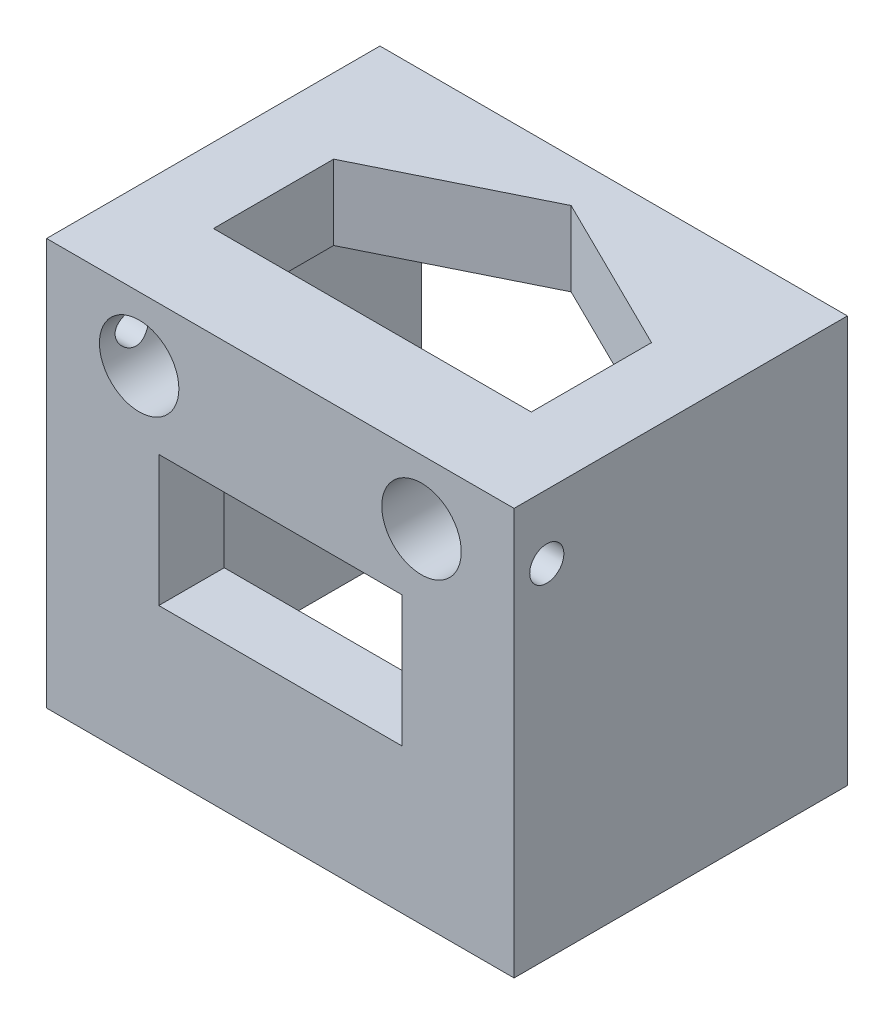
ISO-10303-21;
HEADER;
FILE_DESCRIPTION(('STEP AP214'),'2;1');
FILE_NAME('part.step','',(''),(''),'','','');
FILE_SCHEMA(('AUTOMOTIVE_DESIGN { 1 0 10303 214 1 1 1 1 }'));
ENDSEC;
DATA;
#1=APPLICATION_CONTEXT('core data for automotive mechanical design processes');
#2=APPLICATION_PROTOCOL_DEFINITION('international standard','automotive_design',2000,#1);
#3=PRODUCT_CONTEXT('',#1,'mechanical');
#4=PRODUCT('Part','Part','',(#3));
#5=PRODUCT_RELATED_PRODUCT_CATEGORY('part','',(#4));
#6=PRODUCT_DEFINITION_FORMATION('','',#4);
#7=PRODUCT_DEFINITION_CONTEXT('part definition',#1,'design');
#8=PRODUCT_DEFINITION('design','',#6,#7);
#9=PRODUCT_DEFINITION_SHAPE('','',#8);
#10=(LENGTH_UNIT() NAMED_UNIT(*) SI_UNIT(.MILLI.,.METRE.));
#11=(NAMED_UNIT(*) PLANE_ANGLE_UNIT() SI_UNIT($,.RADIAN.));
#12=(NAMED_UNIT(*) SI_UNIT($,.STERADIAN.) SOLID_ANGLE_UNIT());
#13=UNCERTAINTY_MEASURE_WITH_UNIT(LENGTH_MEASURE(1.E-05),#10,'distance_accuracy_value','');
#14=(GEOMETRIC_REPRESENTATION_CONTEXT(3) GLOBAL_UNCERTAINTY_ASSIGNED_CONTEXT((#13)) GLOBAL_UNIT_ASSIGNED_CONTEXT((#10,
#11,#12)) REPRESENTATION_CONTEXT('',''));
#15=CARTESIAN_POINT('',(0.,0.,0.));
#16=DIRECTION('',(0.,0.,1.));
#17=DIRECTION('',(1.,0.,0.));
#18=AXIS2_PLACEMENT_3D('',#15,#16,#17);
#19=CARTESIAN_POINT('',(0.,-46.7023912995869,-109.68664931792));
#20=DIRECTION('',(0.,1.,0.));
#21=DIRECTION('',(1.,0.,0.));
#22=AXIS2_PLACEMENT_3D('',#19,#20,#21);
#23=PLANE('',#22);
#24=DIRECTION('',(0.,0.,1.));
#25=VECTOR('',#24,1.);
#26=CARTESIAN_POINT('',(20.5480106430197,-46.7023912995869,-100.));
#27=LINE('',#26,#25);
#28=CARTESIAN_POINT('',(20.5480106430197,-46.7023912995869,-128.653778885567));
#29=VERTEX_POINT('',#28);
#30=CARTESIAN_POINT('',(20.5480106430197,-46.7023912995869,-100.));
#31=VERTEX_POINT('',#30);
#32=EDGE_CURVE('E315',#29,#31,#27,.T.);
#33=ORIENTED_EDGE('',*,*,#32,.T.);
#34=DIRECTION('',(1.,0.,0.));
#35=VECTOR('',#34,1.);
#36=CARTESIAN_POINT('',(0.,-46.7023912995869,-100.));
#37=LINE('',#36,#35);
#38=CARTESIAN_POINT('',(19.1931621025294,-46.7023912995869,-100.));
#39=VERTEX_POINT('',#38);
#40=EDGE_CURVE('E330',#39,#31,#37,.T.);
#41=ORIENTED_EDGE('',*,*,#40,.F.);
#42=CARTESIAN_POINT('',(11.0068378974706,-46.7023912995869,-100.));
#43=VERTEX_POINT('',#42);
#44=EDGE_CURVE('E423',#43,#39,#37,.T.);
#45=ORIENTED_EDGE('',*,*,#44,.F.);
#46=CARTESIAN_POINT('',(-11.0068378974706,-46.7023912995869,-100.));
#47=VERTEX_POINT('',#46);
#48=EDGE_CURVE('E419',#47,#43,#37,.T.);
#49=ORIENTED_EDGE('',*,*,#48,.F.);
#50=CARTESIAN_POINT('',(-19.1931621025294,-46.7023912995869,-100.));
#51=VERTEX_POINT('',#50);
#52=EDGE_CURVE('E336',#51,#47,#37,.T.);
#53=ORIENTED_EDGE('',*,*,#52,.F.);
#54=CARTESIAN_POINT('',(-20.5480106430197,-46.7023912995869,-100.));
#55=VERTEX_POINT('',#54);
#56=EDGE_CURVE('E333',#55,#51,#37,.T.);
#57=ORIENTED_EDGE('',*,*,#56,.F.);
#58=DIRECTION('',(0.,0.,-1.));
#59=VECTOR('',#58,1.);
#60=CARTESIAN_POINT('',(-20.5480106430197,-46.7023912995869,-100.));
#61=LINE('',#60,#59);
#62=CARTESIAN_POINT('',(-20.5480106430197,-46.7023912995869,-128.653778885567));
#63=VERTEX_POINT('',#62);
#64=EDGE_CURVE('E322',#55,#63,#61,.T.);
#65=ORIENTED_EDGE('',*,*,#64,.T.);
#66=DIRECTION('',(1.,0.,0.));
#67=VECTOR('',#66,1.);
#68=CARTESIAN_POINT('',(0.,-46.7023912995869,-128.653778885567));
#69=LINE('',#68,#67);
#70=EDGE_CURVE('E184',#63,#29,#69,.T.);
#71=ORIENTED_EDGE('',*,*,#70,.T.);
#72=EDGE_LOOP('',(#33,#41,#45,#49,#53,#57,#65,#71));
#73=FACE_BOUND('',#72,.T.);
#74=DIRECTION('',(-0.896482207295365,0.,0.443079735491063));
#75=VECTOR('',#74,1.);
#76=CARTESIAN_POINT('',(-49.2953876661099,-46.7023912995869,-99.7392442139487));
#77=LINE('',#76,#75);
#78=CARTESIAN_POINT('',(0.,-46.7023912995869,-124.103126899278));
#79=VERTEX_POINT('',#78);
#80=CARTESIAN_POINT('',(-16.9966591035227,-46.7023912995869,-115.702653182637));
#81=VERTEX_POINT('',#80);
#82=EDGE_CURVE('E223',#79,#81,#77,.T.);
#83=ORIENTED_EDGE('',*,*,#82,.T.);
#84=DIRECTION('',(0.,0.,1.));
#85=VECTOR('',#84,1.);
#86=CARTESIAN_POINT('',(-16.9966591035227,-46.7023912995869,0.));
#87=LINE('',#86,#85);
#88=CARTESIAN_POINT('',(-16.9966591035227,-46.7023912995869,-102.843374259976));
#89=VERTEX_POINT('',#88);
#90=EDGE_CURVE('E219',#81,#89,#87,.T.);
#91=ORIENTED_EDGE('',*,*,#90,.T.);
#92=DIRECTION('',(1.,0.,0.));
#93=VECTOR('',#92,1.);
#94=CARTESIAN_POINT('',(0.,-46.7023912995869,-102.843374259976));
#95=LINE('',#94,#93);
#96=CARTESIAN_POINT('',(16.9966591035227,-46.7023912995869,-102.843374259976));
#97=VERTEX_POINT('',#96);
#98=EDGE_CURVE('E222',#89,#97,#95,.T.);
#99=ORIENTED_EDGE('',*,*,#98,.T.);
#100=DIRECTION('',(0.,0.,1.));
#101=VECTOR('',#100,1.);
#102=CARTESIAN_POINT('',(16.9966591035227,-46.7023912995869,0.));
#103=LINE('',#102,#101);
#104=CARTESIAN_POINT('',(16.9966591035227,-46.7023912995869,-115.702653182638));
#105=VERTEX_POINT('',#104);
#106=EDGE_CURVE('E226',#105,#97,#103,.T.);
#107=ORIENTED_EDGE('',*,*,#106,.F.);
#108=DIRECTION('',(-0.896482207295365,0.,-0.443079735491063));
#109=VECTOR('',#108,1.);
#110=CARTESIAN_POINT('',(49.2953876661099,-46.7023912995869,-99.7392442139487));
#111=LINE('',#110,#109);
#112=EDGE_CURVE('E228',#105,#79,#111,.T.);
#113=ORIENTED_EDGE('',*,*,#112,.T.);
#114=EDGE_LOOP('',(#83,#91,#99,#107,#113));
#115=FACE_BOUND('',#114,.T.);
#116=ADVANCED_FACE('F34',(#73,#115),#23,.F.);
#117=CARTESIAN_POINT('',(0.,-38.7023912995869,-109.68664931792));
#118=DIRECTION('',(0.,1.,0.));
#119=DIRECTION('',(1.,0.,0.));
#120=AXIS2_PLACEMENT_3D('',#117,#118,#119);
#121=PLANE('',#120);
#122=DIRECTION('',(-1.,0.,0.));
#123=VECTOR('',#122,1.);
#124=CARTESIAN_POINT('',(0.,-38.7023912995869,-128.653778885567));
#125=LINE('',#124,#123);
#126=CARTESIAN_POINT('',(25.,-38.7023912995869,-128.653778885567));
#127=VERTEX_POINT('',#126);
#128=CARTESIAN_POINT('',(-25.,-38.7023912995869,-128.653778885567));
#129=VERTEX_POINT('',#128);
#130=EDGE_CURVE('E181',#127,#129,#125,.T.);
#131=ORIENTED_EDGE('',*,*,#130,.T.);
#132=DIRECTION('',(0.,0.,-1.));
#133=VECTOR('',#132,1.);
#134=CARTESIAN_POINT('',(-25.,-38.7023912995869,-109.68664931792));
#135=LINE('',#134,#133);
#136=CARTESIAN_POINT('',(-25.,-38.7023912995869,-93.));
#137=VERTEX_POINT('',#136);
#138=EDGE_CURVE('E337',#137,#129,#135,.T.);
#139=ORIENTED_EDGE('',*,*,#138,.F.);
#140=DIRECTION('',(1.,0.,0.));
#141=VECTOR('',#140,1.);
#142=CARTESIAN_POINT('',(0.,-38.7023912995869,-93.));
#143=LINE('',#142,#141);
#144=CARTESIAN_POINT('',(25.,-38.7023912995869,-93.));
#145=VERTEX_POINT('',#144);
#146=EDGE_CURVE('E314',#137,#145,#143,.T.);
#147=ORIENTED_EDGE('',*,*,#146,.T.);
#148=DIRECTION('',(0.,0.,-1.));
#149=VECTOR('',#148,1.);
#150=CARTESIAN_POINT('',(25.,-38.7023912995869,-109.68664931792));
#151=LINE('',#150,#149);
#152=EDGE_CURVE('E335',#145,#127,#151,.T.);
#153=ORIENTED_EDGE('',*,*,#152,.T.);
#154=EDGE_LOOP('',(#131,#139,#147,#153));
#155=FACE_BOUND('',#154,.T.);
#156=DIRECTION('',(0.,0.,-1.));
#157=VECTOR('',#156,1.);
#158=CARTESIAN_POINT('',(-16.9966591035227,-38.7023912995869,0.));
#159=LINE('',#158,#157);
#160=CARTESIAN_POINT('',(-16.9966591035227,-38.7023912995869,-102.843374259976));
#161=VERTEX_POINT('',#160);
#162=CARTESIAN_POINT('',(-16.9966591035227,-38.7023912995869,-115.702653182637));
#163=VERTEX_POINT('',#162);
#164=EDGE_CURVE('E234',#161,#163,#159,.T.);
#165=ORIENTED_EDGE('',*,*,#164,.T.);
#166=DIRECTION('',(0.896482207295365,0.,-0.443079735491063));
#167=VECTOR('',#166,1.);
#168=CARTESIAN_POINT('',(-49.2953876661099,-38.7023912995869,-99.7392442139487));
#169=LINE('',#168,#167);
#170=CARTESIAN_POINT('',(0.,-38.7023912995869,-124.103126899278));
#171=VERTEX_POINT('',#170);
#172=EDGE_CURVE('E203',#163,#171,#169,.T.);
#173=ORIENTED_EDGE('',*,*,#172,.T.);
#174=DIRECTION('',(0.896482207295365,0.,0.443079735491063));
#175=VECTOR('',#174,1.);
#176=CARTESIAN_POINT('',(49.2953876661099,-38.7023912995869,-99.7392442139487));
#177=LINE('',#176,#175);
#178=CARTESIAN_POINT('',(16.9966591035227,-38.7023912995869,-115.702653182638));
#179=VERTEX_POINT('',#178);
#180=EDGE_CURVE('E200',#171,#179,#177,.T.);
#181=ORIENTED_EDGE('',*,*,#180,.T.);
#182=DIRECTION('',(0.,0.,-1.));
#183=VECTOR('',#182,1.);
#184=CARTESIAN_POINT('',(16.9966591035227,-38.7023912995869,0.));
#185=LINE('',#184,#183);
#186=CARTESIAN_POINT('',(16.9966591035227,-38.7023912995869,-102.843374259976));
#187=VERTEX_POINT('',#186);
#188=EDGE_CURVE('E64',#187,#179,#185,.T.);
#189=ORIENTED_EDGE('',*,*,#188,.F.);
#190=DIRECTION('',(-1.,0.,0.));
#191=VECTOR('',#190,1.);
#192=CARTESIAN_POINT('',(0.,-38.7023912995869,-102.843374259976));
#193=LINE('',#192,#191);
#194=EDGE_CURVE('E237',#187,#161,#193,.T.);
#195=ORIENTED_EDGE('',*,*,#194,.T.);
#196=EDGE_LOOP('',(#165,#173,#181,#189,#195));
#197=FACE_BOUND('',#196,.T.);
#198=ADVANCED_FACE('F36',(#155,#197),#121,.T.);
#199=CARTESIAN_POINT('',(-15.1,-45.5584839596257,-93.));
#200=DIRECTION('',(0.,0.,-1.));
#201=DIRECTION('',(1.,0.,0.));
#202=AXIS2_PLACEMENT_3D('',#199,#200,#201);
#203=CYLINDRICAL_SURFACE('',#202,4.25);
#204=CARTESIAN_POINT('',(-15.1,-45.5584839596257,-100.));
#205=DIRECTION('',(0.,0.,-1.));
#206=DIRECTION('',(1.,0.,0.));
#207=AXIS2_PLACEMENT_3D('',#204,#205,#206);
#208=CIRCLE('',#207,4.25);
#209=EDGE_CURVE('E302',#47,#51,#208,.T.);
#210=ORIENTED_EDGE('',*,*,#209,.T.);
#211=EDGE_CURVE('E47',#51,#47,#208,.T.);
#212=ORIENTED_EDGE('',*,*,#211,.T.);
#213=EDGE_LOOP('',(#210,#212));
#214=FACE_BOUND('',#213,.T.);
#215=CARTESIAN_POINT('',(-15.1,-45.5584839596257,-93.));
#216=DIRECTION('',(0.,0.,-1.));
#217=DIRECTION('',(1.,0.,0.));
#218=AXIS2_PLACEMENT_3D('',#215,#216,#217);
#219=CIRCLE('',#218,4.25);
#220=CARTESIAN_POINT('',(-10.85,-45.5584839596257,-93.));
#221=VERTEX_POINT('',#220);
#222=EDGE_CURVE('E303',#221,#221,#219,.T.);
#223=ORIENTED_EDGE('',*,*,#222,.F.);
#224=EDGE_LOOP('',(#223));
#225=FACE_BOUND('',#224,.T.);
#226=CARTESIAN_POINT('',(-19.35,-45.5584839596257,-98.325));
#227=CARTESIAN_POINT('',(-19.3499968128479,-45.4609950908269,-98.3249960302712));
#228=CARTESIAN_POINT('',(-19.3466078099134,-45.3633448804366,-98.3171424944032));
#229=CARTESIAN_POINT('',(-19.3333897415991,-45.1708351423393,-98.2860308901673));
#230=CARTESIAN_POINT('',(-19.3235444571524,-45.0759832732156,-98.2627340244269));
#231=CARTESIAN_POINT('',(-19.2984625840764,-44.8921602470201,-98.2017576606739));
#232=CARTESIAN_POINT('',(-19.2832447259367,-44.8031699177281,-98.1641280954824));
#233=CARTESIAN_POINT('',(-19.2488880079346,-44.6328565690097,-98.07576941773));
#234=CARTESIAN_POINT('',(-19.229750201738,-44.5515314977536,-98.0250438243746));
#235=CARTESIAN_POINT('',(-19.1883269453186,-44.3944406217165,-97.9091167456958));
#236=CARTESIAN_POINT('',(-19.1659343292625,-44.3191307982691,-97.8433360237716));
#237=CARTESIAN_POINT('',(-19.1209721781101,-44.1802154614253,-97.7003929034692));
#238=CARTESIAN_POINT('',(-19.0984025516751,-44.1166164706965,-97.6232242050903));
#239=CARTESIAN_POINT('',(-19.0542973437311,-43.9995889719109,-97.4547440412616));
#240=CARTESIAN_POINT('',(-19.0328799909803,-43.9468782787904,-97.3628997302751));
#241=CARTESIAN_POINT('',(-18.9952179943535,-43.857857475546,-97.1705989172132));
#242=CARTESIAN_POINT('',(-18.9789705249959,-43.8215384023998,-97.0701471575788));
#243=CARTESIAN_POINT('',(-18.9546551153584,-43.7682442817657,-96.8687317207552));
#244=CARTESIAN_POINT('',(-18.9462171523414,-43.7503888395292,-96.7680474585922));
#245=CARTESIAN_POINT('',(-18.9374198720541,-43.7317858169049,-96.5647857629281));
#246=CARTESIAN_POINT('',(-18.9370556911359,-43.7310279369377,-96.4622095064437));
#247=CARTESIAN_POINT('',(-18.9441359715142,-43.7459814630243,-96.2671054870986));
#248=CARTESIAN_POINT('',(-18.9509396083191,-43.760341230336,-96.1744460771738));
#249=CARTESIAN_POINT('',(-18.9705002063154,-43.8028445894362,-95.9930079535824));
#250=CARTESIAN_POINT('',(-18.9832583933184,-43.8309910194244,-95.904230043084));
#251=CARTESIAN_POINT('',(-19.0135831223653,-43.9008236342331,-95.7307638478818));
#252=CARTESIAN_POINT('',(-19.0312486940724,-43.9427923933563,-95.6462074151134));
#253=CARTESIAN_POINT('',(-19.069378119488,-44.0388771431023,-95.4849950953045));
#254=CARTESIAN_POINT('',(-19.0898431119015,-44.0929980825769,-95.4083424456093));
#255=CARTESIAN_POINT('',(-19.1335114645988,-44.2175820546914,-95.2578284411182));
#256=CARTESIAN_POINT('',(-19.1567952343414,-44.2890794148711,-95.184844029868));
#257=CARTESIAN_POINT('',(-19.201927752645,-44.443514536136,-95.0515965297474));
#258=CARTESIAN_POINT('',(-19.22377612139,-44.526455307363,-94.99133679864));
#259=CARTESIAN_POINT('',(-19.2642839387275,-44.704229171685,-94.883852577808));
#260=CARTESIAN_POINT('',(-19.2828461552726,-44.799314608373,-94.8370060597638));
#261=CARTESIAN_POINT('',(-19.3139343415504,-44.9970181149021,-94.7602857984565));
#262=CARTESIAN_POINT('',(-19.3264638591279,-45.0996317163888,-94.7304020774768));
#263=CARTESIAN_POINT('',(-19.3433993744312,-45.3021686139012,-94.6903403065803));
#264=CARTESIAN_POINT('',(-19.3482890633882,-45.4018189192517,-94.6789866972314));
#265=CARTESIAN_POINT('',(-19.3509539881352,-45.6017137405354,-94.6727764071294));
#266=CARTESIAN_POINT('',(-19.3487314308991,-45.7019580625057,-94.6779146088673));
#267=CARTESIAN_POINT('',(-19.3377323928524,-45.8945491837895,-94.7037198135711));
#268=CARTESIAN_POINT('',(-19.3293123216578,-45.9870318199073,-94.7235427080529));
#269=CARTESIAN_POINT('',(-19.3071554611271,-46.1672457697127,-94.7769589495065));
#270=CARTESIAN_POINT('',(-19.293418010988,-46.2549764913236,-94.8105540080079));
#271=CARTESIAN_POINT('',(-19.2613982149047,-46.4262974650568,-94.8916504684434));
#272=CARTESIAN_POINT('',(-19.2429873190849,-46.5096728164691,-94.9395534353137));
#273=CARTESIAN_POINT('',(-19.2035602163723,-46.6675023143771,-95.0474669344231));
#274=CARTESIAN_POINT('',(-19.1825428973387,-46.741952625796,-95.1074826419756));
#275=CARTESIAN_POINT('',(-19.1381870302412,-46.8857474038148,-95.2432201058094));
#276=CARTESIAN_POINT('',(-19.1147931669051,-46.9542794404644,-95.3197865996729));
#277=CARTESIAN_POINT('',(-19.0697106526677,-47.077769741565,-95.4836703816982));
#278=CARTESIAN_POINT('',(-19.0480224835841,-47.1327241799911,-95.5709906898089));
#279=CARTESIAN_POINT('',(-19.008569627053,-47.2283093511824,-95.7561251066043));
#280=CARTESIAN_POINT('',(-18.9908836360395,-47.2686608254465,-95.8541014415229));
#281=CARTESIAN_POINT('',(-18.962462286378,-47.3319297723405,-96.0564615146581));
#282=CARTESIAN_POINT('',(-18.9517207149917,-47.3548628313585,-96.160839433974));
#283=CARTESIAN_POINT('',(-18.9393932813779,-47.3810506958543,-96.3639701121276));
#284=CARTESIAN_POINT('',(-18.9371388043334,-47.3857435467433,-96.4624975094038));
#285=CARTESIAN_POINT('',(-18.9402458282865,-47.3792053486577,-96.6588894727849));
#286=CARTESIAN_POINT('',(-18.9456059726865,-47.3679771361314,-96.7567541538365));
#287=CARTESIAN_POINT('',(-18.962711278598,-47.3311476807947,-96.943729325775));
#288=CARTESIAN_POINT('',(-18.9741065393151,-47.3063317762091,-97.0330296910478));
#289=CARTESIAN_POINT('',(-19.0017024814658,-47.2438262150876,-97.2062063366602));
#290=CARTESIAN_POINT('',(-19.0179045301536,-47.206132895206,-97.2900810654397));
#291=CARTESIAN_POINT('',(-19.054534148979,-47.116254939193,-97.4557183442313));
#292=CARTESIAN_POINT('',(-19.0751616172923,-47.0633158638622,-97.5370264139006));
#293=CARTESIAN_POINT('',(-19.1177969431837,-46.9454704189868,-97.6900538623857));
#294=CARTESIAN_POINT('',(-19.1398053235474,-46.8805594988856,-97.7617695771576));
#295=CARTESIAN_POINT('',(-19.1848190660575,-46.734509929753,-97.8994419622071));
#296=CARTESIAN_POINT('',(-19.207764969047,-46.6524923274572,-97.964490130082));
#297=CARTESIAN_POINT('',(-19.2503359966527,-46.4778728288016,-98.0799690271936));
#298=CARTESIAN_POINT('',(-19.2699596140061,-46.3852661601185,-98.1303931291058));
#299=CARTESIAN_POINT('',(-19.30343706632,-46.1932865217605,-98.2141953624341));
#300=CARTESIAN_POINT('',(-19.3173700211548,-46.0940303785819,-98.2478088119677));
#301=CARTESIAN_POINT('',(-19.3382189144353,-45.8907025658753,-98.2975380219038));
#302=CARTESIAN_POINT('',(-19.3451565704277,-45.7866468556885,-98.3137079483155));
#303=CARTESIAN_POINT('',(-19.3488019686468,-45.6614979603471,-98.3222078935008));
#304=CARTESIAN_POINT('',(-19.349250524727,-45.6409135814144,-98.3232540412422));
#305=CARTESIAN_POINT('',(-19.3498498784228,-45.5997165276077,-98.3246505165581));
#306=CARTESIAN_POINT('',(-19.3500006741153,-45.5791038525519,-98.3250008396383));
#307=CARTESIAN_POINT('',(-19.35,-45.5584839596257,-98.325));
#308=B_SPLINE_CURVE_WITH_KNOTS('',3,(#226,#227,#228,#229,#230,#231,#232,#233,#234,#235,#236,
#237,#238,#239,#240,#241,#242,#243,#244,#245,#246,#247,#248,#249,#250,#251,#252,#253,#254,#255,
#256,#257,#258,#259,#260,#261,#262,#263,#264,#265,#266,#267,#268,#269,#270,#271,#272,#273,#274,
#275,#276,#277,#278,#279,#280,#281,#282,#283,#284,#285,#286,#287,#288,#289,#290,#291,#292,#293,
#294,#295,#296,#297,#298,#299,#300,#301,#302,#303,#304,#305,#306,#307),.UNSPECIFIED.,.T.,.F.,(4,
2,2,2,2,2,2,2,2,2,2,2,2,2,2,2,2,2,2,2,2,2,2,2,2,2,2,2,2,2,2,2,2,2,2,2,2,2,2,2,4),(0.,
0.292381478532447,0.585500287850879,0.877607122818474,1.16963554348223,1.47571982781592,
1.78197408183342,2.10446216156835,2.4267736888769,2.73288771901277,3.03881734098574,
3.31954368921804,3.60032785365642,3.88725099336245,4.17429119220693,4.487248653589,
4.80028859464079,5.12143503203502,5.44239237104406,5.74206141007652,6.04163746897787,
6.32521209298918,6.60882196880223,6.90128983429321,7.19388292572923,7.5086124616026,
7.82343058406718,8.14398541480496,8.46425306686491,8.75868791449455,9.05307031309505,
9.33200130092729,9.61101170474772,9.90734550784714,10.2037921818793,10.5237613768617,
10.8438753494994,11.1593732739478,11.4738886620402,11.5357299359833,11.5975716093482),.UNSPECIFIED.);
#309=CARTESIAN_POINT('',(-19.35,-45.5584839596257,-98.325));
#310=VERTEX_POINT('',#309);
#311=EDGE_CURVE('E38',#310,#310,#308,.T.);
#312=ORIENTED_EDGE('',*,*,#311,.F.);
#313=EDGE_LOOP('',(#312));
#314=FACE_BOUND('',#313,.T.);
#315=ADVANCED_FACE('F358',(#214,#225,#314),#203,.F.);
#316=CARTESIAN_POINT('',(0.,-104.330848197399,-100.));
#317=DIRECTION('',(0.,0.,1.));
#318=DIRECTION('',(-1.,0.,0.));
#319=AXIS2_PLACEMENT_3D('',#316,#317,#318);
#320=PLANE('',#319);
#321=ORIENTED_EDGE('',*,*,#44,.T.);
#322=CARTESIAN_POINT('',(15.1,-45.5584839596257,-100.));
#323=DIRECTION('',(0.,0.,-1.));
#324=DIRECTION('',(-1.,0.,0.));
#325=AXIS2_PLACEMENT_3D('',#322,#323,#324);
#326=CIRCLE('',#325,4.25);
#327=EDGE_CURVE('E11',#43,#39,#326,.T.);
#328=ORIENTED_EDGE('',*,*,#327,.F.);
#329=EDGE_LOOP('',(#321,#328));
#330=FACE_BOUND('',#329,.T.);
#331=ADVANCED_FACE('F381',(#330),#320,.T.);
#332=ORIENTED_EDGE('',*,*,#52,.T.);
#333=ORIENTED_EDGE('',*,*,#211,.F.);
#334=EDGE_LOOP('',(#332,#333));
#335=FACE_BOUND('',#334,.T.);
#336=ADVANCED_FACE('F379',(#335),#320,.T.);
#337=CARTESIAN_POINT('',(0.,-104.330848197399,-128.653778885567));
#338=DIRECTION('',(0.,0.,1.));
#339=DIRECTION('',(-1.,0.,0.));
#340=AXIS2_PLACEMENT_3D('',#337,#338,#339);
#341=PLANE('',#340);
#342=CARTESIAN_POINT('',(20.,-42.7023912995869,-128.653778885567));
#343=DIRECTION('',(0.,0.,-1.));
#344=DIRECTION('',(-1.,0.,0.));
#345=AXIS2_PLACEMENT_3D('',#342,#343,#344);
#346=CIRCLE('',#345,1.825);
#347=CARTESIAN_POINT('',(18.175,-42.7023912995869,-128.653778885567));
#348=VERTEX_POINT('',#347);
#349=EDGE_CURVE('E256',#348,#348,#346,.T.);
#350=ORIENTED_EDGE('',*,*,#349,.F.);
#351=EDGE_LOOP('',(#350));
#352=FACE_BOUND('',#351,.T.);
#353=CARTESIAN_POINT('',(-20.,-42.7023912995869,-128.653778885567));
#354=DIRECTION('',(0.,0.,-1.));
#355=DIRECTION('',(1.,0.,0.));
#356=AXIS2_PLACEMENT_3D('',#353,#354,#355);
#357=CIRCLE('',#356,1.82499999999999);
#358=CARTESIAN_POINT('',(-18.175,-42.7023912995869,-128.653778885567));
#359=VERTEX_POINT('',#358);
#360=EDGE_CURVE('E230',#359,#359,#357,.T.);
#361=ORIENTED_EDGE('',*,*,#360,.F.);
#362=EDGE_LOOP('',(#361));
#363=FACE_BOUND('',#362,.T.);
#364=DIRECTION('',(0.,1.,0.));
#365=VECTOR('',#364,1.);
#366=CARTESIAN_POINT('',(20.5480106430197,-73.7023912995869,-128.653778885567));
#367=LINE('',#366,#365);
#368=CARTESIAN_POINT('',(20.5480106430197,-82.2023912995869,-128.653778885567));
#369=VERTEX_POINT('',#368);
#370=EDGE_CURVE('E317',#369,#29,#367,.T.);
#371=ORIENTED_EDGE('',*,*,#370,.T.);
#372=ORIENTED_EDGE('',*,*,#70,.F.);
#373=DIRECTION('',(0.,1.,0.));
#374=VECTOR('',#373,1.);
#375=CARTESIAN_POINT('',(-20.5480106430197,-73.7023912995869,-128.653778885567));
#376=LINE('',#375,#374);
#377=CARTESIAN_POINT('',(-20.5480106430197,-82.2023912995869,-128.653778885567));
#378=VERTEX_POINT('',#377);
#379=EDGE_CURVE('E324',#378,#63,#376,.T.);
#380=ORIENTED_EDGE('',*,*,#379,.F.);
#381=DIRECTION('',(1.,0.,0.));
#382=VECTOR('',#381,1.);
#383=CARTESIAN_POINT('',(-25.,-82.2023912995869,-128.653778885567));
#384=LINE('',#383,#382);
#385=CARTESIAN_POINT('',(-25.,-82.2023912995869,-128.653778885567));
#386=VERTEX_POINT('',#385);
#387=EDGE_CURVE('E212',#386,#378,#384,.T.);
#388=ORIENTED_EDGE('',*,*,#387,.F.);
#389=DIRECTION('',(0.,1.,0.));
#390=VECTOR('',#389,1.);
#391=CARTESIAN_POINT('',(-25.,-104.330848197399,-128.653778885567));
#392=LINE('',#391,#390);
#393=EDGE_CURVE('E185',#386,#129,#392,.T.);
#394=ORIENTED_EDGE('',*,*,#393,.T.);
#395=ORIENTED_EDGE('',*,*,#130,.F.);
#396=DIRECTION('',(0.,1.,0.));
#397=VECTOR('',#396,1.);
#398=CARTESIAN_POINT('',(25.,-104.330848197399,-128.653778885567));
#399=LINE('',#398,#397);
#400=CARTESIAN_POINT('',(25.,-82.2023912995869,-128.653778885567));
#401=VERTEX_POINT('',#400);
#402=EDGE_CURVE('E174',#401,#127,#399,.T.);
#403=ORIENTED_EDGE('',*,*,#402,.F.);
#404=DIRECTION('',(1.,0.,0.));
#405=VECTOR('',#404,1.);
#406=CARTESIAN_POINT('',(20.5480106430197,-82.2023912995869,-128.653778885567));
#407=LINE('',#406,#405);
#408=EDGE_CURVE('E178',#369,#401,#407,.T.);
#409=ORIENTED_EDGE('',*,*,#408,.F.);
#410=EDGE_LOOP('',(#371,#372,#380,#388,#394,#395,#403,#409));
#411=FACE_BOUND('',#410,.T.);
#412=ADVANCED_FACE('F176',(#352,#363,#411),#341,.F.);
#413=CARTESIAN_POINT('',(-25.,-45.1023912995869,-109.68664931792));
#414=DIRECTION('',(1.,0.,0.));
#415=DIRECTION('',(0.,0.,1.));
#416=AXIS2_PLACEMENT_3D('',#413,#414,#415);
#417=PLANE('',#416);
#418=CARTESIAN_POINT('',(-25.,-45.5584839596257,-96.5));
#419=DIRECTION('',(-1.,0.,0.));
#420=DIRECTION('',(0.,0.,1.));
#421=AXIS2_PLACEMENT_3D('',#418,#419,#420);
#422=CIRCLE('',#421,1.82499999999999);
#423=CARTESIAN_POINT('',(-25.,-45.5584839596257,-94.675));
#424=VERTEX_POINT('',#423);
#425=EDGE_CURVE('E255',#424,#424,#422,.T.);
#426=ORIENTED_EDGE('',*,*,#425,.F.);
#427=EDGE_LOOP('',(#426));
#428=FACE_BOUND('',#427,.T.);
#429=ORIENTED_EDGE('',*,*,#138,.T.);
#430=ORIENTED_EDGE('',*,*,#393,.F.);
#431=DIRECTION('',(0.,0.,-1.));
#432=VECTOR('',#431,1.);
#433=CARTESIAN_POINT('',(-25.,-82.2023912995869,-93.));
#434=LINE('',#433,#432);
#435=CARTESIAN_POINT('',(-25.,-82.2023912995869,-93.));
#436=VERTEX_POINT('',#435);
#437=EDGE_CURVE('E215',#436,#386,#434,.T.);
#438=ORIENTED_EDGE('',*,*,#437,.F.);
#439=DIRECTION('',(0.,1.,0.));
#440=VECTOR('',#439,1.);
#441=CARTESIAN_POINT('',(-25.,-73.7023912995869,-93.));
#442=LINE('',#441,#440);
#443=EDGE_CURVE('E312',#436,#137,#442,.T.);
#444=ORIENTED_EDGE('',*,*,#443,.T.);
#445=EDGE_LOOP('',(#429,#430,#438,#444));
#446=FACE_BOUND('',#445,.T.);
#447=ADVANCED_FACE('F378',(#428,#446),#417,.F.);
#448=CARTESIAN_POINT('',(25.,-45.1023912995869,-109.68664931792));
#449=DIRECTION('',(1.,0.,0.));
#450=DIRECTION('',(0.,0.,1.));
#451=AXIS2_PLACEMENT_3D('',#448,#449,#450);
#452=PLANE('',#451);
#453=CARTESIAN_POINT('',(25.,-45.5584839596257,-96.5));
#454=DIRECTION('',(-1.,0.,0.));
#455=DIRECTION('',(0.,0.,1.));
#456=AXIS2_PLACEMENT_3D('',#453,#454,#455);
#457=CIRCLE('',#456,1.82499999999999);
#458=CARTESIAN_POINT('',(25.,-45.5584839596257,-94.675));
#459=VERTEX_POINT('',#458);
#460=EDGE_CURVE('E266',#459,#459,#457,.T.);
#461=ORIENTED_EDGE('',*,*,#460,.T.);
#462=EDGE_LOOP('',(#461));
#463=FACE_BOUND('',#462,.T.);
#464=ORIENTED_EDGE('',*,*,#402,.T.);
#465=ORIENTED_EDGE('',*,*,#152,.F.);
#466=DIRECTION('',(0.,-1.,0.));
#467=VECTOR('',#466,1.);
#468=CARTESIAN_POINT('',(25.,-73.7023912995869,-93.));
#469=LINE('',#468,#467);
#470=CARTESIAN_POINT('',(25.,-82.2023912995869,-93.));
#471=VERTEX_POINT('',#470);
#472=EDGE_CURVE('E190',#145,#471,#469,.T.);
#473=ORIENTED_EDGE('',*,*,#472,.T.);
#474=DIRECTION('',(0.,0.,1.));
#475=VECTOR('',#474,1.);
#476=CARTESIAN_POINT('',(25.,-82.2023912995869,-128.653778885567));
#477=LINE('',#476,#475);
#478=EDGE_CURVE('E188',#401,#471,#477,.T.);
#479=ORIENTED_EDGE('',*,*,#478,.F.);
#480=EDGE_LOOP('',(#464,#465,#473,#479));
#481=FACE_BOUND('',#480,.T.);
#482=ADVANCED_FACE('F189',(#463,#481),#452,.T.);
#483=CARTESIAN_POINT('',(-20.5480106430197,-73.7023912995869,-100.));
#484=DIRECTION('',(-1.,0.,0.));
#485=DIRECTION('',(0.,0.,-1.));
#486=AXIS2_PLACEMENT_3D('',#483,#484,#485);
#487=PLANE('',#486);
#488=ORIENTED_EDGE('',*,*,#64,.F.);
#489=DIRECTION('',(0.,1.,0.));
#490=VECTOR('',#489,1.);
#491=CARTESIAN_POINT('',(-20.5480106430197,-73.7023912995869,-100.));
#492=LINE('',#491,#490);
#493=CARTESIAN_POINT('',(-20.5480106430197,-82.2023912995869,-100.));
#494=VERTEX_POINT('',#493);
#495=EDGE_CURVE('E327',#494,#55,#492,.T.);
#496=ORIENTED_EDGE('',*,*,#495,.F.);
#497=DIRECTION('',(0.,0.,1.));
#498=VECTOR('',#497,1.);
#499=CARTESIAN_POINT('',(-20.5480106430197,-82.2023912995869,-128.653778885567));
#500=LINE('',#499,#498);
#501=EDGE_CURVE('E209',#378,#494,#500,.T.);
#502=ORIENTED_EDGE('',*,*,#501,.F.);
#503=ORIENTED_EDGE('',*,*,#379,.T.);
#504=EDGE_LOOP('',(#488,#496,#502,#503));
#505=FACE_BOUND('',#504,.T.);
#506=ADVANCED_FACE('F371',(#505),#487,.F.);
#507=CARTESIAN_POINT('',(20.5480106430197,-73.7023912995869,-100.));
#508=DIRECTION('',(1.,0.,0.));
#509=DIRECTION('',(0.,0.,1.));
#510=AXIS2_PLACEMENT_3D('',#507,#508,#509);
#511=PLANE('',#510);
#512=ORIENTED_EDGE('',*,*,#32,.F.);
#513=ORIENTED_EDGE('',*,*,#370,.F.);
#514=DIRECTION('',(0.,0.,-1.));
#515=VECTOR('',#514,1.);
#516=CARTESIAN_POINT('',(20.5480106430197,-82.2023912995869,-100.));
#517=LINE('',#516,#515);
#518=CARTESIAN_POINT('',(20.5480106430197,-82.2023912995869,-100.));
#519=VERTEX_POINT('',#518);
#520=EDGE_CURVE('E199',#519,#369,#517,.T.);
#521=ORIENTED_EDGE('',*,*,#520,.F.);
#522=DIRECTION('',(0.,1.,0.));
#523=VECTOR('',#522,1.);
#524=CARTESIAN_POINT('',(20.5480106430197,-73.7023912995869,-100.));
#525=LINE('',#524,#523);
#526=EDGE_CURVE('E319',#519,#31,#525,.T.);
#527=ORIENTED_EDGE('',*,*,#526,.T.);
#528=EDGE_LOOP('',(#512,#513,#521,#527));
#529=FACE_BOUND('',#528,.T.);
#530=ADVANCED_FACE('F367',(#529),#511,.F.);
#531=CARTESIAN_POINT('',(0.,0.,-100.));
#532=DIRECTION('',(0.,0.,-1.));
#533=DIRECTION('',(1.,0.,0.));
#534=AXIS2_PLACEMENT_3D('',#531,#532,#533);
#535=PLANE('',#534);
#536=DIRECTION('',(1.,0.,0.));
#537=VECTOR('',#536,1.);
#538=CARTESIAN_POINT('',(-13.,-52.7023912995869,-100.));
#539=LINE('',#538,#537);
#540=CARTESIAN_POINT('',(-13.,-52.7023912995869,-100.));
#541=VERTEX_POINT('',#540);
#542=CARTESIAN_POINT('',(13.,-52.7023912995869,-100.));
#543=VERTEX_POINT('',#542);
#544=EDGE_CURVE('E274',#541,#543,#539,.T.);
#545=ORIENTED_EDGE('',*,*,#544,.F.);
#546=DIRECTION('',(0.,1.,0.));
#547=VECTOR('',#546,1.);
#548=CARTESIAN_POINT('',(-13.,-66.7023912995869,-100.));
#549=LINE('',#548,#547);
#550=CARTESIAN_POINT('',(-13.,-66.7023912995869,-100.));
#551=VERTEX_POINT('',#550);
#552=EDGE_CURVE('E290',#551,#541,#549,.T.);
#553=ORIENTED_EDGE('',*,*,#552,.F.);
#554=DIRECTION('',(-1.,0.,0.));
#555=VECTOR('',#554,1.);
#556=CARTESIAN_POINT('',(-13.,-66.7023912995869,-100.));
#557=LINE('',#556,#555);
#558=CARTESIAN_POINT('',(13.,-66.7023912995869,-100.));
#559=VERTEX_POINT('',#558);
#560=EDGE_CURVE('E287',#559,#551,#557,.T.);
#561=ORIENTED_EDGE('',*,*,#560,.F.);
#562=DIRECTION('',(0.,-1.,0.));
#563=VECTOR('',#562,1.);
#564=CARTESIAN_POINT('',(13.,-66.7023912995869,-100.));
#565=LINE('',#564,#563);
#566=EDGE_CURVE('E284',#543,#559,#565,.T.);
#567=ORIENTED_EDGE('',*,*,#566,.F.);
#568=EDGE_LOOP('',(#545,#553,#561,#567));
#569=FACE_BOUND('',#568,.T.);
#570=ORIENTED_EDGE('',*,*,#48,.T.);
#571=EDGE_CURVE('E49',#39,#43,#326,.T.);
#572=ORIENTED_EDGE('',*,*,#571,.F.);
#573=ORIENTED_EDGE('',*,*,#40,.T.);
#574=ORIENTED_EDGE('',*,*,#526,.F.);
#575=DIRECTION('',(1.,0.,0.));
#576=VECTOR('',#575,1.);
#577=CARTESIAN_POINT('',(-20.5480106430197,-82.2023912995869,-100.));
#578=LINE('',#577,#576);
#579=EDGE_CURVE('E205',#494,#519,#578,.T.);
#580=ORIENTED_EDGE('',*,*,#579,.F.);
#581=ORIENTED_EDGE('',*,*,#495,.T.);
#582=ORIENTED_EDGE('',*,*,#56,.T.);
#583=ORIENTED_EDGE('',*,*,#209,.F.);
#584=EDGE_LOOP('',(#570,#572,#573,#574,#580,#581,#582,#583));
#585=FACE_BOUND('',#584,.T.);
#586=ADVANCED_FACE('F363',(#569,#585),#535,.T.);
#587=CARTESIAN_POINT('',(0.,0.,-93.));
#588=DIRECTION('',(0.,0.,-1.));
#589=DIRECTION('',(1.,0.,0.));
#590=AXIS2_PLACEMENT_3D('',#587,#588,#589);
#591=PLANE('',#590);
#592=ORIENTED_EDGE('',*,*,#222,.T.);
#593=EDGE_LOOP('',(#592));
#594=FACE_BOUND('',#593,.T.);
#595=CARTESIAN_POINT('',(15.1,-45.5584839596257,-93.));
#596=DIRECTION('',(0.,0.,-1.));
#597=DIRECTION('',(-1.,0.,0.));
#598=AXIS2_PLACEMENT_3D('',#595,#596,#597);
#599=CIRCLE('',#598,4.25);
#600=CARTESIAN_POINT('',(10.85,-45.5584839596257,-93.));
#601=VERTEX_POINT('',#600);
#602=EDGE_CURVE('E308',#601,#601,#599,.T.);
#603=ORIENTED_EDGE('',*,*,#602,.T.);
#604=EDGE_LOOP('',(#603));
#605=FACE_BOUND('',#604,.T.);
#606=ORIENTED_EDGE('',*,*,#472,.F.);
#607=ORIENTED_EDGE('',*,*,#146,.F.);
#608=ORIENTED_EDGE('',*,*,#443,.F.);
#609=DIRECTION('',(-1.,0.,0.));
#610=VECTOR('',#609,1.);
#611=CARTESIAN_POINT('',(25.,-82.2023912995869,-93.));
#612=LINE('',#611,#610);
#613=EDGE_CURVE('E194',#471,#436,#612,.T.);
#614=ORIENTED_EDGE('',*,*,#613,.F.);
#615=EDGE_LOOP('',(#606,#607,#608,#614));
#616=FACE_BOUND('',#615,.T.);
#617=DIRECTION('',(0.,-1.,0.));
#618=VECTOR('',#617,1.);
#619=CARTESIAN_POINT('',(13.,-66.7023912995869,-93.));
#620=LINE('',#619,#618);
#621=CARTESIAN_POINT('',(13.,-52.7023912995869,-93.));
#622=VERTEX_POINT('',#621);
#623=CARTESIAN_POINT('',(13.,-66.7023912995869,-93.));
#624=VERTEX_POINT('',#623);
#625=EDGE_CURVE('E270',#622,#624,#620,.T.);
#626=ORIENTED_EDGE('',*,*,#625,.T.);
#627=DIRECTION('',(-1.,0.,0.));
#628=VECTOR('',#627,1.);
#629=CARTESIAN_POINT('',(-13.,-66.7023912995869,-93.));
#630=LINE('',#629,#628);
#631=CARTESIAN_POINT('',(-13.,-66.7023912995869,-93.));
#632=VERTEX_POINT('',#631);
#633=EDGE_CURVE('E273',#624,#632,#630,.T.);
#634=ORIENTED_EDGE('',*,*,#633,.T.);
#635=DIRECTION('',(0.,1.,0.));
#636=VECTOR('',#635,1.);
#637=CARTESIAN_POINT('',(-13.,-66.7023912995869,-93.));
#638=LINE('',#637,#636);
#639=CARTESIAN_POINT('',(-13.,-52.7023912995869,-93.));
#640=VERTEX_POINT('',#639);
#641=EDGE_CURVE('E277',#632,#640,#638,.T.);
#642=ORIENTED_EDGE('',*,*,#641,.T.);
#643=DIRECTION('',(1.,0.,0.));
#644=VECTOR('',#643,1.);
#645=CARTESIAN_POINT('',(-13.,-52.7023912995869,-93.));
#646=LINE('',#645,#644);
#647=EDGE_CURVE('E280',#640,#622,#646,.T.);
#648=ORIENTED_EDGE('',*,*,#647,.T.);
#649=EDGE_LOOP('',(#626,#634,#642,#648));
#650=FACE_BOUND('',#649,.T.);
#651=ADVANCED_FACE('F356',(#594,#605,#616,#650),#591,.F.);
#652=CARTESIAN_POINT('',(15.1,-45.5584839596257,-93.));
#653=DIRECTION('',(0.,0.,-1.));
#654=DIRECTION('',(1.,0.,0.));
#655=AXIS2_PLACEMENT_3D('',#652,#653,#654);
#656=CYLINDRICAL_SURFACE('',#655,4.25);
#657=CARTESIAN_POINT('',(19.35,-45.5584839596257,-94.675));
#658=CARTESIAN_POINT('',(19.3499968128479,-45.6559728284244,-94.6750039697288));
#659=CARTESIAN_POINT('',(19.3466078099134,-45.7536230388147,-94.6828575055969));
#660=CARTESIAN_POINT('',(19.3333897415991,-45.946132776912,-94.7139691098328));
#661=CARTESIAN_POINT('',(19.3235444571524,-46.0409846460357,-94.7372659755732));
#662=CARTESIAN_POINT('',(19.2984625840764,-46.2248076722312,-94.7982423393261));
#663=CARTESIAN_POINT('',(19.2832447259367,-46.3137980015232,-94.8358719045177));
#664=CARTESIAN_POINT('',(19.2488880079346,-46.4841113502416,-94.9242305822701));
#665=CARTESIAN_POINT('',(19.229750201738,-46.5654364214978,-94.9749561756255));
#666=CARTESIAN_POINT('',(19.1883269453186,-46.7225272975348,-95.0908832543042));
#667=CARTESIAN_POINT('',(19.1659343292625,-46.7978371209822,-95.1566639762285));
#668=CARTESIAN_POINT('',(19.1209721781101,-46.936752457826,-95.2996070965308));
#669=CARTESIAN_POINT('',(19.0984025516751,-47.0003514485548,-95.3767757949097));
#670=CARTESIAN_POINT('',(19.0542973437311,-47.1173789473404,-95.5452559587384));
#671=CARTESIAN_POINT('',(19.0328799909803,-47.1700896404609,-95.637100269725));
#672=CARTESIAN_POINT('',(18.9952179943535,-47.2591104437053,-95.8294010827868));
#673=CARTESIAN_POINT('',(18.9789705249959,-47.2954295168515,-95.9298528424213));
#674=CARTESIAN_POINT('',(18.9546551153585,-47.3487236374856,-96.1312682792448));
#675=CARTESIAN_POINT('',(18.9462171523414,-47.3665790797221,-96.2319525414079));
#676=CARTESIAN_POINT('',(18.9374198720541,-47.3851821023464,-96.435214237072));
#677=CARTESIAN_POINT('',(18.9370556911359,-47.3859399823137,-96.5377904935563));
#678=CARTESIAN_POINT('',(18.9441359715142,-47.370986456227,-96.7328945129014));
#679=CARTESIAN_POINT('',(18.9509396083191,-47.3566266889153,-96.8255539228263));
#680=CARTESIAN_POINT('',(18.9705002063154,-47.3141233298151,-97.0069920464177));
#681=CARTESIAN_POINT('',(18.9832583933184,-47.2859768998269,-97.0957699569161));
#682=CARTESIAN_POINT('',(19.0135831223653,-47.2161442850182,-97.2692361521182));
#683=CARTESIAN_POINT('',(19.0312486940724,-47.174175525895,-97.3537925848866));
#684=CARTESIAN_POINT('',(19.069378119488,-47.078090776149,-97.5150049046956));
#685=CARTESIAN_POINT('',(19.0898431119015,-47.0239698366744,-97.5916575543907));
#686=CARTESIAN_POINT('',(19.1335114645988,-46.8993858645599,-97.7421715588819));
#687=CARTESIAN_POINT('',(19.1567952343414,-46.8278885043802,-97.8151559701321));
#688=CARTESIAN_POINT('',(19.201927752645,-46.6734533831153,-97.9484034702527));
#689=CARTESIAN_POINT('',(19.22377612139,-46.5905126118883,-98.0086632013601));
#690=CARTESIAN_POINT('',(19.2642839387276,-46.4127387475663,-98.116147422192));
#691=CARTESIAN_POINT('',(19.2828461552726,-46.3176533108783,-98.1629939402363));
#692=CARTESIAN_POINT('',(19.3139343415504,-46.1199498043493,-98.2397142015435));
#693=CARTESIAN_POINT('',(19.3264638591279,-46.0173362028625,-98.2695979225232));
#694=CARTESIAN_POINT('',(19.3433993744312,-45.8147993053501,-98.3096596934198));
#695=CARTESIAN_POINT('',(19.3482890633882,-45.7151489999996,-98.3210133027687));
#696=CARTESIAN_POINT('',(19.3509539881352,-45.5152541787159,-98.3272235928706));
#697=CARTESIAN_POINT('',(19.3487314308991,-45.4150098567456,-98.3220853911328));
#698=CARTESIAN_POINT('',(19.3377323928524,-45.2224187354618,-98.2962801864289));
#699=CARTESIAN_POINT('',(19.3293123216578,-45.129936099344,-98.2764572919471));
#700=CARTESIAN_POINT('',(19.3071554611271,-44.9497221495386,-98.2230410504936));
#701=CARTESIAN_POINT('',(19.293418010988,-44.8619914279277,-98.1894459919921));
#702=CARTESIAN_POINT('',(19.2613982149047,-44.6906704541945,-98.1083495315567));
#703=CARTESIAN_POINT('',(19.2429873190849,-44.6072951027822,-98.0604465646864));
#704=CARTESIAN_POINT('',(19.2035602163723,-44.4494656048742,-97.952533065577));
#705=CARTESIAN_POINT('',(19.1825428973387,-44.3750152934554,-97.8925173580245));
#706=CARTESIAN_POINT('',(19.1381870302412,-44.2312205154366,-97.7567798941907));
#707=CARTESIAN_POINT('',(19.1147931669051,-44.1626884787869,-97.6802134003272));
#708=CARTESIAN_POINT('',(19.0697106526677,-44.0391981776863,-97.5163296183018));
#709=CARTESIAN_POINT('',(19.0480224835841,-43.9842437392602,-97.4290093101912));
#710=CARTESIAN_POINT('',(19.008569627053,-43.8886585680689,-97.2438748933958));
#711=CARTESIAN_POINT('',(18.9908836360395,-43.8483070938048,-97.1458985584772));
#712=CARTESIAN_POINT('',(18.962462286378,-43.7850381469109,-96.943538485342));
#713=CARTESIAN_POINT('',(18.9517207149918,-43.7621050878928,-96.839160566026));
#714=CARTESIAN_POINT('',(18.9393932813779,-43.735917223397,-96.6360298878724));
#715=CARTESIAN_POINT('',(18.9371388043334,-43.731224372508,-96.5375024905962));
#716=CARTESIAN_POINT('',(18.9402458282865,-43.7377625705936,-96.3411105272152));
#717=CARTESIAN_POINT('',(18.9456059726865,-43.7489907831199,-96.2432458461636));
#718=CARTESIAN_POINT('',(18.9627112785981,-43.7858202384566,-96.056270674225));
#719=CARTESIAN_POINT('',(18.9741065393151,-43.8106361430422,-95.9669703089523));
#720=CARTESIAN_POINT('',(19.0017024814658,-43.8731417041637,-95.7937936633398));
#721=CARTESIAN_POINT('',(19.0179045301536,-43.9108350240453,-95.7099189345603));
#722=CARTESIAN_POINT('',(19.054534148979,-44.0007129800583,-95.5442816557688));
#723=CARTESIAN_POINT('',(19.0751616172923,-44.0536520553891,-95.4629735860995));
#724=CARTESIAN_POINT('',(19.1177969431837,-44.1714975002645,-95.3099461376144));
#725=CARTESIAN_POINT('',(19.1398053235474,-44.2364084203657,-95.2382304228424));
#726=CARTESIAN_POINT('',(19.1848190660575,-44.3824579894983,-95.1005580377929));
#727=CARTESIAN_POINT('',(19.207764969047,-44.4644755917941,-95.035509869918));
#728=CARTESIAN_POINT('',(19.2503359966527,-44.6390950904497,-94.9200309728065));
#729=CARTESIAN_POINT('',(19.2699596140061,-44.7317017591328,-94.8696068708943));
#730=CARTESIAN_POINT('',(19.30343706632,-44.9236813974908,-94.7858046375659));
#731=CARTESIAN_POINT('',(19.3173700211548,-45.0229375406694,-94.7521911880324));
#732=CARTESIAN_POINT('',(19.3382189144353,-45.226265353376,-94.7024619780963));
#733=CARTESIAN_POINT('',(19.3451565704277,-45.3303210635628,-94.6862920516846));
#734=CARTESIAN_POINT('',(19.3488019686468,-45.4554699589042,-94.6777921064993));
#735=CARTESIAN_POINT('',(19.349250524727,-45.4760543378369,-94.6767459587579));
#736=CARTESIAN_POINT('',(19.3498498784228,-45.5172513916436,-94.675349483442));
#737=CARTESIAN_POINT('',(19.3500006741153,-45.5378640666994,-94.6749991603618));
#738=CARTESIAN_POINT('',(19.35,-45.5584839596257,-94.675));
#739=B_SPLINE_CURVE_WITH_KNOTS('',3,(#657,#658,#659,#660,#661,#662,#663,#664,#665,#666,#667,
#668,#669,#670,#671,#672,#673,#674,#675,#676,#677,#678,#679,#680,#681,#682,#683,#684,#685,#686,
#687,#688,#689,#690,#691,#692,#693,#694,#695,#696,#697,#698,#699,#700,#701,#702,#703,#704,#705,
#706,#707,#708,#709,#710,#711,#712,#713,#714,#715,#716,#717,#718,#719,#720,#721,#722,#723,#724,
#725,#726,#727,#728,#729,#730,#731,#732,#733,#734,#735,#736,#737,#738),.UNSPECIFIED.,.T.,.F.,(4,
2,2,2,2,2,2,2,2,2,2,2,2,2,2,2,2,2,2,2,2,2,2,2,2,2,2,2,2,2,2,2,2,2,2,2,2,2,2,2,4),(0.,
0.292381478532447,0.585500287850879,0.87760712281848,1.16963554348223,1.47571982781594,
1.7819740818334,2.10446216156833,2.4267736888769,2.73288771901279,3.03881734098576,
3.31954368921804,3.60032785365642,3.88725099336246,4.17429119220694,4.487248653589,
4.8002885946408,5.12143503203502,5.44239237104406,5.74206141007653,6.04163746897787,
6.32521209298918,6.60882196880224,6.90128983429321,7.19388292572923,7.50861246160261,
7.82343058406719,8.14398541480495,8.46425306686491,8.75868791449455,9.05307031309506,
9.33200130092731,9.61101170474773,9.90734550784715,10.2037921818793,10.5237613768617,
10.8438753494994,11.1593732739478,11.4738886620402,11.5357299359833,11.5975716093482),.UNSPECIFIED.);
#740=CARTESIAN_POINT('',(19.35,-45.5584839596257,-94.675));
#741=VERTEX_POINT('',#740);
#742=EDGE_CURVE('E269',#741,#741,#739,.T.);
#743=ORIENTED_EDGE('',*,*,#742,.T.);
#744=EDGE_LOOP('',(#743));
#745=FACE_BOUND('',#744,.T.);
#746=ORIENTED_EDGE('',*,*,#602,.F.);
#747=EDGE_LOOP('',(#746));
#748=FACE_BOUND('',#747,.T.);
#749=ORIENTED_EDGE('',*,*,#571,.T.);
#750=ORIENTED_EDGE('',*,*,#327,.T.);
#751=EDGE_LOOP('',(#749,#750));
#752=FACE_BOUND('',#751,.T.);
#753=ADVANCED_FACE('F351',(#745,#748,#752),#656,.F.);
#754=CARTESIAN_POINT('',(13.,-66.7023912995869,-93.));
#755=DIRECTION('',(-1.,0.,0.));
#756=DIRECTION('',(0.,-1.,0.));
#757=AXIS2_PLACEMENT_3D('',#754,#755,#756);
#758=PLANE('',#757);
#759=ORIENTED_EDGE('',*,*,#566,.T.);
#760=DIRECTION('',(0.,0.,-1.));
#761=VECTOR('',#760,1.);
#762=CARTESIAN_POINT('',(13.,-66.7023912995869,-93.));
#763=LINE('',#762,#761);
#764=EDGE_CURVE('E300',#624,#559,#763,.T.);
#765=ORIENTED_EDGE('',*,*,#764,.F.);
#766=ORIENTED_EDGE('',*,*,#625,.F.);
#767=DIRECTION('',(0.,0.,-1.));
#768=VECTOR('',#767,1.);
#769=CARTESIAN_POINT('',(13.,-52.7023912995869,-93.));
#770=LINE('',#769,#768);
#771=EDGE_CURVE('E283',#622,#543,#770,.T.);
#772=ORIENTED_EDGE('',*,*,#771,.T.);
#773=EDGE_LOOP('',(#759,#765,#766,#772));
#774=FACE_BOUND('',#773,.T.);
#775=ADVANCED_FACE('F355',(#774),#758,.T.);
#776=CARTESIAN_POINT('',(-13.,-66.7023912995869,-93.));
#777=DIRECTION('',(0.,1.,0.));
#778=DIRECTION('',(-1.,0.,0.));
#779=AXIS2_PLACEMENT_3D('',#776,#777,#778);
#780=PLANE('',#779);
#781=ORIENTED_EDGE('',*,*,#560,.T.);
#782=DIRECTION('',(0.,0.,-1.));
#783=VECTOR('',#782,1.);
#784=CARTESIAN_POINT('',(-13.,-66.7023912995869,-93.));
#785=LINE('',#784,#783);
#786=EDGE_CURVE('E298',#632,#551,#785,.T.);
#787=ORIENTED_EDGE('',*,*,#786,.F.);
#788=ORIENTED_EDGE('',*,*,#633,.F.);
#789=ORIENTED_EDGE('',*,*,#764,.T.);
#790=EDGE_LOOP('',(#781,#787,#788,#789));
#791=FACE_BOUND('',#790,.T.);
#792=ADVANCED_FACE('F564',(#791),#780,.T.);
#793=CARTESIAN_POINT('',(-13.,-66.7023912995869,-93.));
#794=DIRECTION('',(1.,0.,0.));
#795=DIRECTION('',(0.,0.,1.));
#796=AXIS2_PLACEMENT_3D('',#793,#794,#795);
#797=PLANE('',#796);
#798=ORIENTED_EDGE('',*,*,#552,.T.);
#799=DIRECTION('',(0.,0.,-1.));
#800=VECTOR('',#799,1.);
#801=CARTESIAN_POINT('',(-13.,-52.7023912995869,-93.));
#802=LINE('',#801,#800);
#803=EDGE_CURVE('E296',#640,#541,#802,.T.);
#804=ORIENTED_EDGE('',*,*,#803,.F.);
#805=ORIENTED_EDGE('',*,*,#641,.F.);
#806=ORIENTED_EDGE('',*,*,#786,.T.);
#807=EDGE_LOOP('',(#798,#804,#805,#806));
#808=FACE_BOUND('',#807,.T.);
#809=ADVANCED_FACE('F406',(#808),#797,.T.);
#810=CARTESIAN_POINT('',(-13.,-52.7023912995869,-93.));
#811=DIRECTION('',(0.,-1.,0.));
#812=DIRECTION('',(0.,0.,1.));
#813=AXIS2_PLACEMENT_3D('',#810,#811,#812);
#814=PLANE('',#813);
#815=ORIENTED_EDGE('',*,*,#544,.T.);
#816=ORIENTED_EDGE('',*,*,#771,.F.);
#817=ORIENTED_EDGE('',*,*,#647,.F.);
#818=ORIENTED_EDGE('',*,*,#803,.T.);
#819=EDGE_LOOP('',(#815,#816,#817,#818));
#820=FACE_BOUND('',#819,.T.);
#821=ADVANCED_FACE('F398',(#820),#814,.T.);
#822=CARTESIAN_POINT('',(17.,-45.5584839596257,-96.5));
#823=DIRECTION('',(1.,0.,0.));
#824=DIRECTION('',(0.,0.,1.));
#825=AXIS2_PLACEMENT_3D('',#822,#823,#824);
#826=CYLINDRICAL_SURFACE('',#825,1.82499999999999);
#827=ORIENTED_EDGE('',*,*,#742,.F.);
#828=EDGE_LOOP('',(#827));
#829=FACE_BOUND('',#828,.T.);
#830=ORIENTED_EDGE('',*,*,#460,.F.);
#831=EDGE_LOOP('',(#830));
#832=FACE_BOUND('',#831,.T.);
#833=ADVANCED_FACE('F348',(#829,#832),#826,.F.);
#834=CARTESIAN_POINT('',(-17.,-45.5584839596257,-96.5));
#835=DIRECTION('',(-1.,0.,0.));
#836=DIRECTION('',(0.,0.,-1.));
#837=AXIS2_PLACEMENT_3D('',#834,#835,#836);
#838=CYLINDRICAL_SURFACE('',#837,1.82499999999999);
#839=ORIENTED_EDGE('',*,*,#311,.T.);
#840=EDGE_LOOP('',(#839));
#841=FACE_BOUND('',#840,.T.);
#842=ORIENTED_EDGE('',*,*,#425,.T.);
#843=EDGE_LOOP('',(#842));
#844=FACE_BOUND('',#843,.T.);
#845=ADVANCED_FACE('F397',(#841,#844),#838,.F.);
#846=CARTESIAN_POINT('',(-20.,-42.7023912995869,-113.653778885567));
#847=DIRECTION('',(0.,0.,-1.));
#848=DIRECTION('',(-1.,0.,0.));
#849=AXIS2_PLACEMENT_3D('',#846,#847,#848);
#850=CYLINDRICAL_SURFACE('',#849,1.82499999999999);
#851=CARTESIAN_POINT('',(-20.,-42.7023912995869,-113.653778885567));
#852=DIRECTION('',(0.,0.,-1.));
#853=DIRECTION('',(1.,0.,0.));
#854=AXIS2_PLACEMENT_3D('',#851,#852,#853);
#855=CIRCLE('',#854,1.82499999999999);
#856=CARTESIAN_POINT('',(-18.175,-42.7023912995869,-113.653778885567));
#857=VERTEX_POINT('',#856);
#858=EDGE_CURVE('E259',#857,#857,#855,.T.);
#859=ORIENTED_EDGE('',*,*,#858,.F.);
#860=EDGE_LOOP('',(#859));
#861=FACE_BOUND('',#860,.T.);
#862=ORIENTED_EDGE('',*,*,#360,.T.);
#863=EDGE_LOOP('',(#862));
#864=FACE_BOUND('',#863,.T.);
#865=ADVANCED_FACE('F404',(#861,#864),#850,.F.);
#866=CARTESIAN_POINT('',(-20.,-42.7023912995869,-113.653778885567));
#867=DIRECTION('',(0.,0.,1.));
#868=DIRECTION('',(1.,0.,0.));
#869=AXIS2_PLACEMENT_3D('',#866,#867,#868);
#870=PLANE('',#869);
#871=ORIENTED_EDGE('',*,*,#858,.T.);
#872=EDGE_LOOP('',(#871));
#873=FACE_BOUND('',#872,.T.);
#874=ADVANCED_FACE('F489',(#873),#870,.F.);
#875=CARTESIAN_POINT('',(20.,-42.7023912995869,-113.653778885567));
#876=DIRECTION('',(0.,0.,-1.));
#877=DIRECTION('',(-1.,0.,0.));
#878=AXIS2_PLACEMENT_3D('',#875,#876,#877);
#879=CYLINDRICAL_SURFACE('',#878,1.825);
#880=CARTESIAN_POINT('',(20.,-42.7023912995869,-113.653778885567));
#881=DIRECTION('',(0.,0.,-1.));
#882=DIRECTION('',(-1.,0.,0.));
#883=AXIS2_PLACEMENT_3D('',#880,#881,#882);
#884=CIRCLE('',#883,1.825);
#885=CARTESIAN_POINT('',(18.175,-42.7023912995869,-113.653778885567));
#886=VERTEX_POINT('',#885);
#887=EDGE_CURVE('E252',#886,#886,#884,.T.);
#888=ORIENTED_EDGE('',*,*,#887,.F.);
#889=EDGE_LOOP('',(#888));
#890=FACE_BOUND('',#889,.T.);
#891=ORIENTED_EDGE('',*,*,#349,.T.);
#892=EDGE_LOOP('',(#891));
#893=FACE_BOUND('',#892,.T.);
#894=ADVANCED_FACE('F485',(#890,#893),#879,.F.);
#895=CARTESIAN_POINT('',(20.,-42.7023912995869,-113.653778885567));
#896=DIRECTION('',(0.,0.,-1.));
#897=DIRECTION('',(-1.,0.,0.));
#898=AXIS2_PLACEMENT_3D('',#895,#896,#897);
#899=PLANE('',#898);
#900=ORIENTED_EDGE('',*,*,#887,.T.);
#901=EDGE_LOOP('',(#900));
#902=FACE_BOUND('',#901,.T.);
#903=ADVANCED_FACE('F480',(#902),#899,.T.);
#904=CARTESIAN_POINT('',(-49.2953876661099,-86.7963155900546,-99.7392442139487));
#905=DIRECTION('',(0.443079735491063,0.,0.896482207295365));
#906=DIRECTION('',(0.896482207295365,0.,-0.443079735491063));
#907=AXIS2_PLACEMENT_3D('',#904,#905,#906);
#908=PLANE('',#907);
#909=DIRECTION('',(0.,1.,0.));
#910=VECTOR('',#909,1.);
#911=CARTESIAN_POINT('',(0.,-86.7963155900546,-124.103126899278));
#912=LINE('',#911,#910);
#913=EDGE_CURVE('E56',#79,#171,#912,.T.);
#914=ORIENTED_EDGE('',*,*,#913,.T.);
#915=ORIENTED_EDGE('',*,*,#172,.F.);
#916=DIRECTION('',(0.,1.,0.));
#917=VECTOR('',#916,1.);
#918=CARTESIAN_POINT('',(-16.9966591035227,-86.7963155900546,-115.702653182637));
#919=LINE('',#918,#917);
#920=EDGE_CURVE('E247',#81,#163,#919,.T.);
#921=ORIENTED_EDGE('',*,*,#920,.F.);
#922=ORIENTED_EDGE('',*,*,#82,.F.);
#923=EDGE_LOOP('',(#914,#915,#921,#922));
#924=FACE_BOUND('',#923,.T.);
#925=ADVANCED_FACE('F461',(#924),#908,.T.);
#926=CARTESIAN_POINT('',(-16.9966591035227,-86.7963155900546,0.));
#927=DIRECTION('',(1.,0.,0.));
#928=DIRECTION('',(0.,0.,-1.));
#929=AXIS2_PLACEMENT_3D('',#926,#927,#928);
#930=PLANE('',#929);
#931=ORIENTED_EDGE('',*,*,#920,.T.);
#932=ORIENTED_EDGE('',*,*,#164,.F.);
#933=DIRECTION('',(0.,1.,0.));
#934=VECTOR('',#933,1.);
#935=CARTESIAN_POINT('',(-16.9966591035227,-86.7963155900546,-102.843374259976));
#936=LINE('',#935,#934);
#937=EDGE_CURVE('E245',#89,#161,#936,.T.);
#938=ORIENTED_EDGE('',*,*,#937,.F.);
#939=ORIENTED_EDGE('',*,*,#90,.F.);
#940=EDGE_LOOP('',(#931,#932,#938,#939));
#941=FACE_BOUND('',#940,.T.);
#942=ADVANCED_FACE('F458',(#941),#930,.T.);
#943=CARTESIAN_POINT('',(0.,-86.7963155900546,-102.843374259976));
#944=DIRECTION('',(0.,0.,-1.));
#945=DIRECTION('',(-1.,0.,0.));
#946=AXIS2_PLACEMENT_3D('',#943,#944,#945);
#947=PLANE('',#946);
#948=ORIENTED_EDGE('',*,*,#937,.T.);
#949=ORIENTED_EDGE('',*,*,#194,.F.);
#950=DIRECTION('',(0.,1.,0.));
#951=VECTOR('',#950,1.);
#952=CARTESIAN_POINT('',(16.9966591035227,-86.7963155900546,-102.843374259976));
#953=LINE('',#952,#951);
#954=EDGE_CURVE('E243',#97,#187,#953,.T.);
#955=ORIENTED_EDGE('',*,*,#954,.F.);
#956=ORIENTED_EDGE('',*,*,#98,.F.);
#957=EDGE_LOOP('',(#948,#949,#955,#956));
#958=FACE_BOUND('',#957,.T.);
#959=ADVANCED_FACE('F467',(#958),#947,.T.);
#960=CARTESIAN_POINT('',(16.9966591035227,-86.7963155900546,0.));
#961=DIRECTION('',(1.,0.,0.));
#962=DIRECTION('',(0.,0.,-1.));
#963=AXIS2_PLACEMENT_3D('',#960,#961,#962);
#964=PLANE('',#963);
#965=ORIENTED_EDGE('',*,*,#106,.T.);
#966=ORIENTED_EDGE('',*,*,#954,.T.);
#967=ORIENTED_EDGE('',*,*,#188,.T.);
#968=DIRECTION('',(0.,1.,0.));
#969=VECTOR('',#968,1.);
#970=CARTESIAN_POINT('',(16.9966591035227,-86.7963155900546,-115.702653182638));
#971=LINE('',#970,#969);
#972=EDGE_CURVE('E241',#105,#179,#971,.T.);
#973=ORIENTED_EDGE('',*,*,#972,.F.);
#974=EDGE_LOOP('',(#965,#966,#967,#973));
#975=FACE_BOUND('',#974,.T.);
#976=ADVANCED_FACE('F464',(#975),#964,.F.);
#977=CARTESIAN_POINT('',(49.2953876661099,-86.7963155900546,-99.7392442139487));
#978=DIRECTION('',(-0.443079735491063,0.,0.896482207295365));
#979=DIRECTION('',(0.896482207295365,0.,0.443079735491063));
#980=AXIS2_PLACEMENT_3D('',#977,#978,#979);
#981=PLANE('',#980);
#982=ORIENTED_EDGE('',*,*,#972,.T.);
#983=ORIENTED_EDGE('',*,*,#180,.F.);
#984=ORIENTED_EDGE('',*,*,#913,.F.);
#985=ORIENTED_EDGE('',*,*,#112,.F.);
#986=EDGE_LOOP('',(#982,#983,#984,#985));
#987=FACE_BOUND('',#986,.T.);
#988=ADVANCED_FACE('F462',(#987),#981,.T.);
#989=CARTESIAN_POINT('',(0.,-82.2023912995869,0.));
#990=DIRECTION('',(0.,-1.,0.));
#991=DIRECTION('',(-1.,0.,0.));
#992=AXIS2_PLACEMENT_3D('',#989,#990,#991);
#993=PLANE('',#992);
#994=ORIENTED_EDGE('',*,*,#478,.T.);
#995=ORIENTED_EDGE('',*,*,#613,.T.);
#996=ORIENTED_EDGE('',*,*,#437,.T.);
#997=ORIENTED_EDGE('',*,*,#387,.T.);
#998=ORIENTED_EDGE('',*,*,#501,.T.);
#999=ORIENTED_EDGE('',*,*,#579,.T.);
#1000=ORIENTED_EDGE('',*,*,#520,.T.);
#1001=ORIENTED_EDGE('',*,*,#408,.T.);
#1002=EDGE_LOOP('',(#994,#995,#996,#997,#998,#999,#1000,#1001));
#1003=FACE_BOUND('',#1002,.T.);
#1004=ADVANCED_FACE('F196',(#1003),#993,.T.);
#1005=CLOSED_SHELL('',(#116,#198,#315,#331,#336,#412,#447,#482,#506,#530,#586,#651,#753,#775,
#792,#809,#821,#833,#845,#865,#874,#894,#903,#925,#942,#959,#976,#988,#1004));
#1006=MANIFOLD_SOLID_BREP('B2',#1005);
#1007=ADVANCED_BREP_SHAPE_REPRESENTATION('',(#18,#1006),#14);
#1008=SHAPE_DEFINITION_REPRESENTATION(#9,#1007);
ENDSEC;
END-ISO-10303-21;
